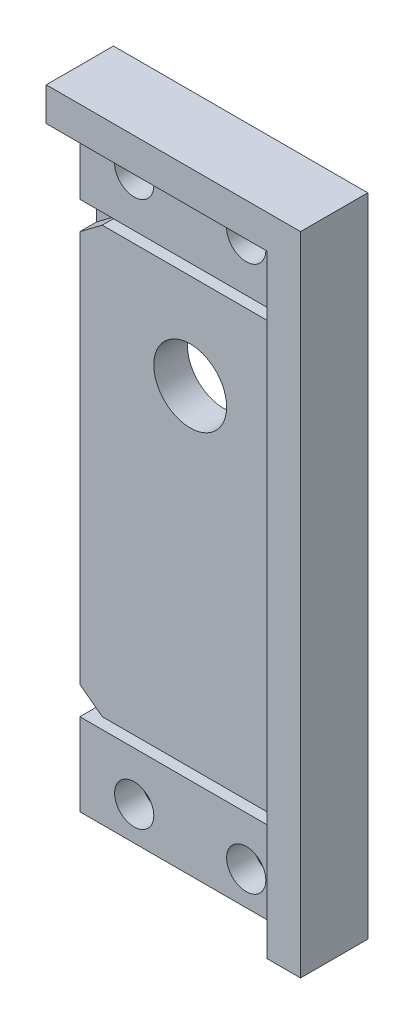
ISO-10303-21;
HEADER;
FILE_DESCRIPTION(('STEP AP214'),'2;1');
FILE_NAME('part.step','',(''),(''),'','','');
FILE_SCHEMA(('AUTOMOTIVE_DESIGN { 1 0 10303 214 1 1 1 1 }'));
ENDSEC;
DATA;
#1=APPLICATION_CONTEXT('core data for automotive mechanical design processes');
#2=APPLICATION_PROTOCOL_DEFINITION('international standard','automotive_design',2000,#1);
#3=PRODUCT_CONTEXT('',#1,'mechanical');
#4=PRODUCT('Part','Part','',(#3));
#5=PRODUCT_RELATED_PRODUCT_CATEGORY('part','',(#4));
#6=PRODUCT_DEFINITION_FORMATION('','',#4);
#7=PRODUCT_DEFINITION_CONTEXT('part definition',#1,'design');
#8=PRODUCT_DEFINITION('design','',#6,#7);
#9=PRODUCT_DEFINITION_SHAPE('','',#8);
#10=(LENGTH_UNIT() NAMED_UNIT(*) SI_UNIT(.MILLI.,.METRE.));
#11=(NAMED_UNIT(*) PLANE_ANGLE_UNIT() SI_UNIT($,.RADIAN.));
#12=(NAMED_UNIT(*) SI_UNIT($,.STERADIAN.) SOLID_ANGLE_UNIT());
#13=UNCERTAINTY_MEASURE_WITH_UNIT(LENGTH_MEASURE(1.E-05),#10,'distance_accuracy_value','');
#14=(GEOMETRIC_REPRESENTATION_CONTEXT(3) GLOBAL_UNCERTAINTY_ASSIGNED_CONTEXT((#13)) GLOBAL_UNIT_ASSIGNED_CONTEXT((#10,
#11,#12)) REPRESENTATION_CONTEXT('',''));
#15=CARTESIAN_POINT('',(0.,0.,0.));
#16=DIRECTION('',(0.,0.,1.));
#17=DIRECTION('',(1.,0.,0.));
#18=AXIS2_PLACEMENT_3D('',#15,#16,#17);
#19=CARTESIAN_POINT('',(0.,0.,3.));
#20=DIRECTION('',(0.,0.,1.));
#21=DIRECTION('',(1.,0.,0.));
#22=AXIS2_PLACEMENT_3D('',#19,#20,#21);
#23=PLANE('',#22);
#24=CARTESIAN_POINT('',(-5.00000000000003,24.35,3.));
#25=DIRECTION('',(0.,0.,1.));
#26=DIRECTION('',(-1.,0.,0.));
#27=AXIS2_PLACEMENT_3D('',#24,#25,#26);
#28=CIRCLE('',#27,1.75);
#29=CARTESIAN_POINT('',(-6.75000000000004,24.35,3.));
#30=VERTEX_POINT('',#29);
#31=EDGE_CURVE('E255',#30,#30,#28,.T.);
#32=ORIENTED_EDGE('',*,*,#31,.F.);
#33=EDGE_LOOP('',(#32));
#34=FACE_BOUND('',#33,.T.);
#35=CARTESIAN_POINT('',(4.99999999999997,24.35,3.));
#36=DIRECTION('',(0.,0.,1.));
#37=DIRECTION('',(-1.,0.,0.));
#38=AXIS2_PLACEMENT_3D('',#35,#36,#37);
#39=CIRCLE('',#38,1.75);
#40=CARTESIAN_POINT('',(3.24999999999997,24.35,3.));
#41=VERTEX_POINT('',#40);
#42=EDGE_CURVE('E308',#41,#41,#39,.T.);
#43=ORIENTED_EDGE('',*,*,#42,.F.);
#44=EDGE_LOOP('',(#43));
#45=FACE_BOUND('',#44,.T.);
#46=DIRECTION('',(0.,-1.,0.));
#47=VECTOR('',#46,1.);
#48=CARTESIAN_POINT('',(-9.85,27.35,3.));
#49=LINE('',#48,#47);
#50=CARTESIAN_POINT('',(-9.85,27.35,3.));
#51=VERTEX_POINT('',#50);
#52=CARTESIAN_POINT('',(-9.85,20.,3.));
#53=VERTEX_POINT('',#52);
#54=EDGE_CURVE('E325',#51,#53,#49,.T.);
#55=ORIENTED_EDGE('',*,*,#54,.T.);
#56=DIRECTION('',(1.,0.,0.));
#57=VECTOR('',#56,1.);
#58=CARTESIAN_POINT('',(0.,20.,3.));
#59=LINE('',#58,#57);
#60=CARTESIAN_POINT('',(9.85,20.,3.));
#61=VERTEX_POINT('',#60);
#62=EDGE_CURVE('E248',#53,#61,#59,.T.);
#63=ORIENTED_EDGE('',*,*,#62,.T.);
#64=DIRECTION('',(0.,1.,0.));
#65=VECTOR('',#64,1.);
#66=CARTESIAN_POINT('',(9.84999999999999,27.35,3.));
#67=LINE('',#66,#65);
#68=CARTESIAN_POINT('',(9.84999999999999,27.35,3.));
#69=VERTEX_POINT('',#68);
#70=EDGE_CURVE('E322',#61,#69,#67,.T.);
#71=ORIENTED_EDGE('',*,*,#70,.T.);
#72=DIRECTION('',(-1.,0.,0.));
#73=VECTOR('',#72,1.);
#74=CARTESIAN_POINT('',(-9.85,27.35,3.));
#75=LINE('',#74,#73);
#76=EDGE_CURVE('E171',#69,#51,#75,.T.);
#77=ORIENTED_EDGE('',*,*,#76,.T.);
#78=EDGE_LOOP('',(#55,#63,#71,#77));
#79=FACE_BOUND('',#78,.T.);
#80=ADVANCED_FACE('F33',(#34,#45,#79),#23,.T.);
#81=CARTESIAN_POINT('',(0.,10.5,3.));
#82=DIRECTION('',(0.,0.,1.));
#83=DIRECTION('',(1.,0.,0.));
#84=AXIS2_PLACEMENT_3D('',#81,#82,#83);
#85=CIRCLE('',#84,3.25);
#86=CARTESIAN_POINT('',(3.25,10.5,3.));
#87=VERTEX_POINT('',#86);
#88=EDGE_CURVE('E209',#87,#87,#85,.T.);
#89=ORIENTED_EDGE('',*,*,#88,.F.);
#90=EDGE_LOOP('',(#89));
#91=FACE_BOUND('',#90,.T.);
#92=DIRECTION('',(0.800000000000001,0.6,0.));
#93=VECTOR('',#92,1.);
#94=CARTESIAN_POINT('',(-11.946,15.928,3.));
#95=LINE('',#94,#93);
#96=CARTESIAN_POINT('',(-9.85,17.5,3.));
#97=VERTEX_POINT('',#96);
#98=CARTESIAN_POINT('',(-7.85,19.,3.));
#99=VERTEX_POINT('',#98);
#100=EDGE_CURVE('E229',#97,#99,#95,.T.);
#101=ORIENTED_EDGE('',*,*,#100,.F.);
#102=CARTESIAN_POINT('',(-9.85,-17.5,3.));
#103=VERTEX_POINT('',#102);
#104=EDGE_CURVE('E329',#97,#103,#49,.T.);
#105=ORIENTED_EDGE('',*,*,#104,.T.);
#106=DIRECTION('',(0.800000000000001,-0.6,0.));
#107=VECTOR('',#106,1.);
#108=CARTESIAN_POINT('',(-11.946,-15.928,3.));
#109=LINE('',#108,#107);
#110=CARTESIAN_POINT('',(-7.85000000000002,-19.,3.));
#111=VERTEX_POINT('',#110);
#112=EDGE_CURVE('E222',#103,#111,#109,.T.);
#113=ORIENTED_EDGE('',*,*,#112,.T.);
#114=DIRECTION('',(1.,0.,0.));
#115=VECTOR('',#114,1.);
#116=CARTESIAN_POINT('',(0.,-19.,3.));
#117=LINE('',#116,#115);
#118=CARTESIAN_POINT('',(7.84999999999999,-19.,3.));
#119=VERTEX_POINT('',#118);
#120=EDGE_CURVE('E269',#111,#119,#117,.T.);
#121=ORIENTED_EDGE('',*,*,#120,.T.);
#122=DIRECTION('',(0.799999999999999,0.600000000000001,0.));
#123=VECTOR('',#122,1.);
#124=CARTESIAN_POINT('',(11.946,-15.928,3.));
#125=LINE('',#124,#123);
#126=CARTESIAN_POINT('',(9.85,-17.5,3.));
#127=VERTEX_POINT('',#126);
#128=EDGE_CURVE('E288',#119,#127,#125,.T.);
#129=ORIENTED_EDGE('',*,*,#128,.T.);
#130=CARTESIAN_POINT('',(9.84999999999999,17.5,3.));
#131=VERTEX_POINT('',#130);
#132=EDGE_CURVE('E321',#127,#131,#67,.T.);
#133=ORIENTED_EDGE('',*,*,#132,.T.);
#134=DIRECTION('',(0.799999999999999,-0.600000000000001,0.));
#135=VECTOR('',#134,1.);
#136=CARTESIAN_POINT('',(11.946,15.928,3.));
#137=LINE('',#136,#135);
#138=CARTESIAN_POINT('',(7.85,19.,3.));
#139=VERTEX_POINT('',#138);
#140=EDGE_CURVE('E244',#139,#131,#137,.T.);
#141=ORIENTED_EDGE('',*,*,#140,.F.);
#142=DIRECTION('',(1.,0.,0.));
#143=VECTOR('',#142,1.);
#144=CARTESIAN_POINT('',(0.,19.,3.));
#145=LINE('',#144,#143);
#146=EDGE_CURVE('E241',#99,#139,#145,.T.);
#147=ORIENTED_EDGE('',*,*,#146,.F.);
#148=EDGE_LOOP('',(#101,#105,#113,#121,#129,#133,#141,#147));
#149=FACE_BOUND('',#148,.T.);
#150=ADVANCED_FACE('F401',(#91,#149),#23,.T.);
#151=CARTESIAN_POINT('',(-9.85,27.35,3.));
#152=DIRECTION('',(1.,0.,0.));
#153=DIRECTION('',(0.,1.,0.));
#154=AXIS2_PLACEMENT_3D('',#151,#152,#153);
#155=PLANE('',#154);
#156=ORIENTED_EDGE('',*,*,#104,.F.);
#157=DIRECTION('',(0.,0.,1.));
#158=VECTOR('',#157,1.);
#159=CARTESIAN_POINT('',(-9.85,17.5,1.5));
#160=LINE('',#159,#158);
#161=CARTESIAN_POINT('',(-9.85,17.5,1.5));
#162=VERTEX_POINT('',#161);
#163=EDGE_CURVE('E256',#162,#97,#160,.T.);
#164=ORIENTED_EDGE('',*,*,#163,.F.);
#165=DIRECTION('',(0.,-1.,0.));
#166=VECTOR('',#165,1.);
#167=CARTESIAN_POINT('',(-9.85,0.,1.5));
#168=LINE('',#167,#166);
#169=CARTESIAN_POINT('',(-9.85,20.,1.5));
#170=VERTEX_POINT('',#169);
#171=EDGE_CURVE('E235',#170,#162,#168,.T.);
#172=ORIENTED_EDGE('',*,*,#171,.F.);
#173=DIRECTION('',(0.,0.,1.));
#174=VECTOR('',#173,1.);
#175=CARTESIAN_POINT('',(-9.85,20.,1.5));
#176=LINE('',#175,#174);
#177=EDGE_CURVE('E258',#170,#53,#176,.T.);
#178=ORIENTED_EDGE('',*,*,#177,.T.);
#179=ORIENTED_EDGE('',*,*,#54,.F.);
#180=DIRECTION('',(0.,0.,-1.));
#181=VECTOR('',#180,1.);
#182=CARTESIAN_POINT('',(-9.85,27.35,6.));
#183=LINE('',#182,#181);
#184=CARTESIAN_POINT('',(-9.85,27.35,6.));
#185=VERTEX_POINT('',#184);
#186=EDGE_CURVE('E175',#185,#51,#183,.T.);
#187=ORIENTED_EDGE('',*,*,#186,.F.);
#188=DIRECTION('',(0.,1.,0.));
#189=VECTOR('',#188,1.);
#190=CARTESIAN_POINT('',(-9.85,30.35,6.));
#191=LINE('',#190,#189);
#192=CARTESIAN_POINT('',(-9.85,30.35,6.));
#193=VERTEX_POINT('',#192);
#194=EDGE_CURVE('E187',#185,#193,#191,.T.);
#195=ORIENTED_EDGE('',*,*,#194,.T.);
#196=DIRECTION('',(0.,0.,-1.));
#197=VECTOR('',#196,1.);
#198=CARTESIAN_POINT('',(-9.85,30.35,6.));
#199=LINE('',#198,#197);
#200=CARTESIAN_POINT('',(-9.85,30.35,0.));
#201=VERTEX_POINT('',#200);
#202=EDGE_CURVE('E215',#193,#201,#199,.T.);
#203=ORIENTED_EDGE('',*,*,#202,.T.);
#204=DIRECTION('',(0.,-1.,0.));
#205=VECTOR('',#204,1.);
#206=CARTESIAN_POINT('',(-9.85,27.35,0.));
#207=LINE('',#206,#205);
#208=CARTESIAN_POINT('',(-9.85,-27.35,0.));
#209=VERTEX_POINT('',#208);
#210=EDGE_CURVE('E317',#201,#209,#207,.T.);
#211=ORIENTED_EDGE('',*,*,#210,.T.);
#212=DIRECTION('',(0.,0.,-1.));
#213=VECTOR('',#212,1.);
#214=CARTESIAN_POINT('',(-9.85,-27.35,3.));
#215=LINE('',#214,#213);
#216=CARTESIAN_POINT('',(-9.85,-27.35,3.));
#217=VERTEX_POINT('',#216);
#218=EDGE_CURVE('E332',#217,#209,#215,.T.);
#219=ORIENTED_EDGE('',*,*,#218,.F.);
#220=CARTESIAN_POINT('',(-9.85,-20.,3.));
#221=VERTEX_POINT('',#220);
#222=EDGE_CURVE('E324',#221,#217,#49,.T.);
#223=ORIENTED_EDGE('',*,*,#222,.F.);
#224=DIRECTION('',(0.,0.,1.));
#225=VECTOR('',#224,1.);
#226=CARTESIAN_POINT('',(-9.85,-20.,1.5));
#227=LINE('',#226,#225);
#228=CARTESIAN_POINT('',(-9.85,-20.,1.5));
#229=VERTEX_POINT('',#228);
#230=EDGE_CURVE('E302',#229,#221,#227,.T.);
#231=ORIENTED_EDGE('',*,*,#230,.F.);
#232=DIRECTION('',(0.,-1.,0.));
#233=VECTOR('',#232,1.);
#234=CARTESIAN_POINT('',(-9.85,0.,1.5));
#235=LINE('',#234,#233);
#236=CARTESIAN_POINT('',(-9.85,-17.5,1.5));
#237=VERTEX_POINT('',#236);
#238=EDGE_CURVE('E268',#237,#229,#235,.T.);
#239=ORIENTED_EDGE('',*,*,#238,.F.);
#240=DIRECTION('',(0.,0.,1.));
#241=VECTOR('',#240,1.);
#242=CARTESIAN_POINT('',(-9.85,-17.5,1.5));
#243=LINE('',#242,#241);
#244=EDGE_CURVE('E282',#237,#103,#243,.T.);
#245=ORIENTED_EDGE('',*,*,#244,.T.);
#246=EDGE_LOOP('',(#156,#164,#172,#178,#179,#187,#195,#203,#211,#219,#223,#231,#239,#245));
#247=FACE_BOUND('',#246,.T.);
#248=ADVANCED_FACE('F388',(#247),#155,.F.);
#249=DIRECTION('',(1.,0.,0.));
#250=VECTOR('',#249,1.);
#251=CARTESIAN_POINT('',(0.,-20.,3.));
#252=LINE('',#251,#250);
#253=CARTESIAN_POINT('',(9.85,-20.,3.));
#254=VERTEX_POINT('',#253);
#255=EDGE_CURVE('E285',#221,#254,#252,.T.);
#256=ORIENTED_EDGE('',*,*,#255,.F.);
#257=ORIENTED_EDGE('',*,*,#222,.T.);
#258=DIRECTION('',(1.,0.,0.));
#259=VECTOR('',#258,1.);
#260=CARTESIAN_POINT('',(-9.85,-27.35,3.));
#261=LINE('',#260,#259);
#262=CARTESIAN_POINT('',(9.85,-27.35,3.));
#263=VERTEX_POINT('',#262);
#264=EDGE_CURVE('E328',#217,#263,#261,.T.);
#265=ORIENTED_EDGE('',*,*,#264,.T.);
#266=EDGE_CURVE('E318',#263,#254,#67,.T.);
#267=ORIENTED_EDGE('',*,*,#266,.T.);
#268=EDGE_LOOP('',(#256,#257,#265,#267));
#269=FACE_BOUND('',#268,.T.);
#270=CARTESIAN_POINT('',(-5.,-24.35,3.));
#271=DIRECTION('',(0.,0.,1.));
#272=DIRECTION('',(1.,0.,0.));
#273=AXIS2_PLACEMENT_3D('',#270,#271,#272);
#274=CIRCLE('',#273,1.75);
#275=CARTESIAN_POINT('',(-3.25,-24.35,3.));
#276=VERTEX_POINT('',#275);
#277=EDGE_CURVE('E314',#276,#276,#274,.T.);
#278=ORIENTED_EDGE('',*,*,#277,.F.);
#279=EDGE_LOOP('',(#278));
#280=FACE_BOUND('',#279,.T.);
#281=CARTESIAN_POINT('',(5.,-24.35,3.));
#282=DIRECTION('',(0.,0.,1.));
#283=DIRECTION('',(1.,0.,0.));
#284=AXIS2_PLACEMENT_3D('',#281,#282,#283);
#285=CIRCLE('',#284,1.75);
#286=CARTESIAN_POINT('',(6.75,-24.35,3.));
#287=VERTEX_POINT('',#286);
#288=EDGE_CURVE('E311',#287,#287,#285,.T.);
#289=ORIENTED_EDGE('',*,*,#288,.F.);
#290=EDGE_LOOP('',(#289));
#291=FACE_BOUND('',#290,.T.);
#292=ADVANCED_FACE('F371',(#269,#280,#291),#23,.T.);
#293=CARTESIAN_POINT('',(0.,0.,0.));
#294=DIRECTION('',(0.,0.,1.));
#295=DIRECTION('',(1.,0.,0.));
#296=AXIS2_PLACEMENT_3D('',#293,#294,#295);
#297=PLANE('',#296);
#298=CARTESIAN_POINT('',(0.,10.5,0.));
#299=DIRECTION('',(0.,0.,1.));
#300=DIRECTION('',(1.,0.,0.));
#301=AXIS2_PLACEMENT_3D('',#298,#299,#300);
#302=CIRCLE('',#301,3.25);
#303=CARTESIAN_POINT('',(3.25,10.5,0.));
#304=VERTEX_POINT('',#303);
#305=EDGE_CURVE('E219',#304,#304,#302,.T.);
#306=ORIENTED_EDGE('',*,*,#305,.T.);
#307=EDGE_LOOP('',(#306));
#308=FACE_BOUND('',#307,.T.);
#309=CARTESIAN_POINT('',(-5.,-24.35,0.));
#310=DIRECTION('',(0.,0.,1.));
#311=DIRECTION('',(1.,0.,0.));
#312=AXIS2_PLACEMENT_3D('',#309,#310,#311);
#313=CIRCLE('',#312,2.35);
#314=CARTESIAN_POINT('',(-2.65,-24.35,0.));
#315=VERTEX_POINT('',#314);
#316=EDGE_CURVE('E347',#315,#315,#313,.T.);
#317=ORIENTED_EDGE('',*,*,#316,.T.);
#318=EDGE_LOOP('',(#317));
#319=FACE_BOUND('',#318,.T.);
#320=CARTESIAN_POINT('',(5.,-24.35,0.));
#321=DIRECTION('',(0.,0.,1.));
#322=DIRECTION('',(1.,0.,0.));
#323=AXIS2_PLACEMENT_3D('',#320,#321,#322);
#324=CIRCLE('',#323,2.35000000000001);
#325=CARTESIAN_POINT('',(7.35000000000002,-24.35,0.));
#326=VERTEX_POINT('',#325);
#327=EDGE_CURVE('E344',#326,#326,#324,.T.);
#328=ORIENTED_EDGE('',*,*,#327,.T.);
#329=EDGE_LOOP('',(#328));
#330=FACE_BOUND('',#329,.T.);
#331=CARTESIAN_POINT('',(-5.00000000000003,24.35,0.));
#332=DIRECTION('',(0.,0.,1.));
#333=DIRECTION('',(1.,0.,0.));
#334=AXIS2_PLACEMENT_3D('',#331,#332,#333);
#335=CIRCLE('',#334,2.35000000000002);
#336=CARTESIAN_POINT('',(-2.65000000000001,24.35,0.));
#337=VERTEX_POINT('',#336);
#338=EDGE_CURVE('E341',#337,#337,#335,.T.);
#339=ORIENTED_EDGE('',*,*,#338,.T.);
#340=EDGE_LOOP('',(#339));
#341=FACE_BOUND('',#340,.T.);
#342=CARTESIAN_POINT('',(4.99999999999997,24.35,0.));
#343=DIRECTION('',(0.,0.,1.));
#344=DIRECTION('',(1.,0.,0.));
#345=AXIS2_PLACEMENT_3D('',#342,#343,#344);
#346=CIRCLE('',#345,2.35);
#347=CARTESIAN_POINT('',(7.34999999999997,24.35,0.));
#348=VERTEX_POINT('',#347);
#349=EDGE_CURVE('E338',#348,#348,#346,.T.);
#350=ORIENTED_EDGE('',*,*,#349,.T.);
#351=EDGE_LOOP('',(#350));
#352=FACE_BOUND('',#351,.T.);
#353=DIRECTION('',(0.,-1.,0.));
#354=VECTOR('',#353,1.);
#355=CARTESIAN_POINT('',(12.85,-27.35,0.));
#356=LINE('',#355,#354);
#357=CARTESIAN_POINT('',(12.85,30.35,0.));
#358=VERTEX_POINT('',#357);
#359=CARTESIAN_POINT('',(12.85,-27.35,0.));
#360=VERTEX_POINT('',#359);
#361=EDGE_CURVE('E192',#358,#360,#356,.T.);
#362=ORIENTED_EDGE('',*,*,#361,.T.);
#363=DIRECTION('',(1.,0.,0.));
#364=VECTOR('',#363,1.);
#365=CARTESIAN_POINT('',(-9.85,-27.35,0.));
#366=LINE('',#365,#364);
#367=EDGE_CURVE('E334',#209,#360,#366,.T.);
#368=ORIENTED_EDGE('',*,*,#367,.F.);
#369=ORIENTED_EDGE('',*,*,#210,.F.);
#370=DIRECTION('',(1.,0.,0.));
#371=VECTOR('',#370,1.);
#372=CARTESIAN_POINT('',(12.85,30.35,0.));
#373=LINE('',#372,#371);
#374=EDGE_CURVE('E195',#201,#358,#373,.T.);
#375=ORIENTED_EDGE('',*,*,#374,.T.);
#376=EDGE_LOOP('',(#362,#368,#369,#375));
#377=FACE_BOUND('',#376,.T.);
#378=ADVANCED_FACE('F367',(#308,#319,#330,#341,#352,#377),#297,.F.);
#379=CARTESIAN_POINT('',(-9.85,-27.35,3.));
#380=DIRECTION('',(0.,1.,0.));
#381=DIRECTION('',(0.,0.,1.));
#382=AXIS2_PLACEMENT_3D('',#379,#380,#381);
#383=PLANE('',#382);
#384=ORIENTED_EDGE('',*,*,#367,.T.);
#385=DIRECTION('',(0.,0.,-1.));
#386=VECTOR('',#385,1.);
#387=CARTESIAN_POINT('',(12.85,-27.35,6.));
#388=LINE('',#387,#386);
#389=CARTESIAN_POINT('',(12.85,-27.35,6.));
#390=VERTEX_POINT('',#389);
#391=EDGE_CURVE('E210',#390,#360,#388,.T.);
#392=ORIENTED_EDGE('',*,*,#391,.F.);
#393=DIRECTION('',(-1.,0.,0.));
#394=VECTOR('',#393,1.);
#395=CARTESIAN_POINT('',(9.85,-27.35,6.));
#396=LINE('',#395,#394);
#397=CARTESIAN_POINT('',(9.85,-27.35,6.));
#398=VERTEX_POINT('',#397);
#399=EDGE_CURVE('E176',#390,#398,#396,.T.);
#400=ORIENTED_EDGE('',*,*,#399,.T.);
#401=DIRECTION('',(0.,0.,-1.));
#402=VECTOR('',#401,1.);
#403=CARTESIAN_POINT('',(9.85,-27.35,6.));
#404=LINE('',#403,#402);
#405=EDGE_CURVE('E191',#398,#263,#404,.T.);
#406=ORIENTED_EDGE('',*,*,#405,.T.);
#407=ORIENTED_EDGE('',*,*,#264,.F.);
#408=ORIENTED_EDGE('',*,*,#218,.T.);
#409=EDGE_LOOP('',(#384,#392,#400,#406,#407,#408));
#410=FACE_BOUND('',#409,.T.);
#411=ADVANCED_FACE('F370',(#410),#383,.F.);
#412=CARTESIAN_POINT('',(-5.,-24.35,3.));
#413=DIRECTION('',(0.,0.,-1.));
#414=DIRECTION('',(-1.,0.,0.));
#415=AXIS2_PLACEMENT_3D('',#412,#413,#414);
#416=CYLINDRICAL_SURFACE('',#415,1.75);
#417=CARTESIAN_POINT('',(-5.,-24.35,0.6));
#418=DIRECTION('',(0.,0.,1.));
#419=DIRECTION('',(1.,0.,0.));
#420=AXIS2_PLACEMENT_3D('',#417,#418,#419);
#421=CIRCLE('',#420,1.75);
#422=CARTESIAN_POINT('',(-3.25,-24.35,0.6));
#423=VERTEX_POINT('',#422);
#424=EDGE_CURVE('E350',#423,#423,#421,.F.);
#425=ORIENTED_EDGE('',*,*,#424,.T.);
#426=EDGE_LOOP('',(#425));
#427=FACE_BOUND('',#426,.T.);
#428=ORIENTED_EDGE('',*,*,#277,.T.);
#429=EDGE_LOOP('',(#428));
#430=FACE_BOUND('',#429,.T.);
#431=ADVANCED_FACE('F426',(#427,#430),#416,.F.);
#432=CARTESIAN_POINT('',(5.,-24.35,3.));
#433=DIRECTION('',(0.,0.,-1.));
#434=DIRECTION('',(-1.,0.,0.));
#435=AXIS2_PLACEMENT_3D('',#432,#433,#434);
#436=CYLINDRICAL_SURFACE('',#435,1.75);
#437=CARTESIAN_POINT('',(5.,-24.35,0.600000000000004));
#438=DIRECTION('',(0.,0.,1.));
#439=DIRECTION('',(1.,0.,0.));
#440=AXIS2_PLACEMENT_3D('',#437,#438,#439);
#441=CIRCLE('',#440,1.75);
#442=CARTESIAN_POINT('',(6.75,-24.35,0.600000000000004));
#443=VERTEX_POINT('',#442);
#444=EDGE_CURVE('E353',#443,#443,#441,.F.);
#445=ORIENTED_EDGE('',*,*,#444,.T.);
#446=EDGE_LOOP('',(#445));
#447=FACE_BOUND('',#446,.T.);
#448=ORIENTED_EDGE('',*,*,#288,.T.);
#449=EDGE_LOOP('',(#448));
#450=FACE_BOUND('',#449,.T.);
#451=ADVANCED_FACE('F423',(#447,#450),#436,.F.);
#452=CARTESIAN_POINT('',(4.99999999999997,24.35,3.));
#453=DIRECTION('',(0.,0.,-1.));
#454=DIRECTION('',(-1.,0.,0.));
#455=AXIS2_PLACEMENT_3D('',#452,#453,#454);
#456=CYLINDRICAL_SURFACE('',#455,1.75);
#457=CARTESIAN_POINT('',(4.99999999999997,24.35,0.6));
#458=DIRECTION('',(0.,0.,1.));
#459=DIRECTION('',(1.,0.,0.));
#460=AXIS2_PLACEMENT_3D('',#457,#458,#459);
#461=CIRCLE('',#460,1.75);
#462=CARTESIAN_POINT('',(6.74999999999997,24.35,0.6));
#463=VERTEX_POINT('',#462);
#464=EDGE_CURVE('E11',#463,#463,#461,.F.);
#465=ORIENTED_EDGE('',*,*,#464,.T.);
#466=EDGE_LOOP('',(#465));
#467=FACE_BOUND('',#466,.T.);
#468=ORIENTED_EDGE('',*,*,#42,.T.);
#469=EDGE_LOOP('',(#468));
#470=FACE_BOUND('',#469,.T.);
#471=ADVANCED_FACE('F425',(#467,#470),#456,.F.);
#472=CARTESIAN_POINT('',(-5.00000000000003,24.35,3.));
#473=DIRECTION('',(0.,0.,-1.));
#474=DIRECTION('',(-1.,0.,0.));
#475=AXIS2_PLACEMENT_3D('',#472,#473,#474);
#476=CYLINDRICAL_SURFACE('',#475,1.75);
#477=CARTESIAN_POINT('',(-5.00000000000003,24.35,0.600000000000016));
#478=DIRECTION('',(0.,0.,1.));
#479=DIRECTION('',(1.,0.,0.));
#480=AXIS2_PLACEMENT_3D('',#477,#478,#479);
#481=CIRCLE('',#480,1.75);
#482=CARTESIAN_POINT('',(-3.25000000000003,24.35,0.600000000000016));
#483=VERTEX_POINT('',#482);
#484=EDGE_CURVE('E41',#483,#483,#481,.F.);
#485=ORIENTED_EDGE('',*,*,#484,.T.);
#486=EDGE_LOOP('',(#485));
#487=FACE_BOUND('',#486,.T.);
#488=ORIENTED_EDGE('',*,*,#31,.T.);
#489=EDGE_LOOP('',(#488));
#490=FACE_BOUND('',#489,.T.);
#491=ADVANCED_FACE('F358',(#487,#490),#476,.F.);
#492=CARTESIAN_POINT('',(-5.,-24.35,0.));
#493=DIRECTION('',(0.,0.,-1.));
#494=DIRECTION('',(-1.,0.,0.));
#495=AXIS2_PLACEMENT_3D('',#492,#493,#494);
#496=CONICAL_SURFACE('',#495,2.35,0.785398163397446);
#497=ORIENTED_EDGE('',*,*,#424,.F.);
#498=EDGE_LOOP('',(#497));
#499=FACE_BOUND('',#498,.T.);
#500=ORIENTED_EDGE('',*,*,#316,.F.);
#501=EDGE_LOOP('',(#500));
#502=FACE_BOUND('',#501,.T.);
#503=ADVANCED_FACE('F439',(#499,#502),#496,.F.);
#504=CARTESIAN_POINT('',(5.,-24.35,0.));
#505=DIRECTION('',(0.,0.,-1.));
#506=DIRECTION('',(-1.,0.,0.));
#507=AXIS2_PLACEMENT_3D('',#504,#505,#506);
#508=CONICAL_SURFACE('',#507,2.35000000000001,0.785398163397454);
#509=ORIENTED_EDGE('',*,*,#444,.F.);
#510=EDGE_LOOP('',(#509));
#511=FACE_BOUND('',#510,.T.);
#512=ORIENTED_EDGE('',*,*,#327,.F.);
#513=EDGE_LOOP('',(#512));
#514=FACE_BOUND('',#513,.T.);
#515=ADVANCED_FACE('F364',(#511,#514),#508,.F.);
#516=CARTESIAN_POINT('',(-5.00000000000003,24.35,0.));
#517=DIRECTION('',(0.,0.,-1.));
#518=DIRECTION('',(-1.,0.,0.));
#519=AXIS2_PLACEMENT_3D('',#516,#517,#518);
#520=CONICAL_SURFACE('',#519,2.35000000000002,0.785398163397448);
#521=ORIENTED_EDGE('',*,*,#484,.F.);
#522=EDGE_LOOP('',(#521));
#523=FACE_BOUND('',#522,.T.);
#524=ORIENTED_EDGE('',*,*,#338,.F.);
#525=EDGE_LOOP('',(#524));
#526=FACE_BOUND('',#525,.T.);
#527=ADVANCED_FACE('F361',(#523,#526),#520,.F.);
#528=CARTESIAN_POINT('',(4.99999999999997,24.35,0.));
#529=DIRECTION('',(0.,0.,-1.));
#530=DIRECTION('',(-1.,0.,0.));
#531=AXIS2_PLACEMENT_3D('',#528,#529,#530);
#532=CONICAL_SURFACE('',#531,2.35,0.785398163397445);
#533=ORIENTED_EDGE('',*,*,#464,.F.);
#534=EDGE_LOOP('',(#533));
#535=FACE_BOUND('',#534,.T.);
#536=ORIENTED_EDGE('',*,*,#349,.F.);
#537=EDGE_LOOP('',(#536));
#538=FACE_BOUND('',#537,.T.);
#539=ADVANCED_FACE('F35',(#535,#538),#532,.F.);
#540=CARTESIAN_POINT('',(-11.946,-15.928,1.5));
#541=DIRECTION('',(-0.599999999999999,-0.8,0.));
#542=DIRECTION('',(0.8,-0.599999999999999,0.));
#543=AXIS2_PLACEMENT_3D('',#540,#541,#542);
#544=PLANE('',#543);
#545=ORIENTED_EDGE('',*,*,#112,.F.);
#546=ORIENTED_EDGE('',*,*,#244,.F.);
#547=DIRECTION('',(0.800000000000001,-0.6,0.));
#548=VECTOR('',#547,1.);
#549=CARTESIAN_POINT('',(-11.946,-15.928,1.5));
#550=LINE('',#549,#548);
#551=CARTESIAN_POINT('',(-7.85000000000002,-19.,1.5));
#552=VERTEX_POINT('',#551);
#553=EDGE_CURVE('E56',#237,#552,#550,.T.);
#554=ORIENTED_EDGE('',*,*,#553,.T.);
#555=DIRECTION('',(0.,0.,1.));
#556=VECTOR('',#555,1.);
#557=CARTESIAN_POINT('',(-7.85000000000002,-19.,1.5));
#558=LINE('',#557,#556);
#559=EDGE_CURVE('E245',#552,#111,#558,.T.);
#560=ORIENTED_EDGE('',*,*,#559,.T.);
#561=EDGE_LOOP('',(#545,#546,#554,#560));
#562=FACE_BOUND('',#561,.T.);
#563=ADVANCED_FACE('F440',(#562),#544,.T.);
#564=CARTESIAN_POINT('',(0.,-19.,1.5));
#565=DIRECTION('',(0.,-1.,0.));
#566=DIRECTION('',(1.,0.,0.));
#567=AXIS2_PLACEMENT_3D('',#564,#565,#566);
#568=PLANE('',#567);
#569=ORIENTED_EDGE('',*,*,#120,.F.);
#570=ORIENTED_EDGE('',*,*,#559,.F.);
#571=DIRECTION('',(1.,0.,0.));
#572=VECTOR('',#571,1.);
#573=CARTESIAN_POINT('',(0.,-19.,1.5));
#574=LINE('',#573,#572);
#575=CARTESIAN_POINT('',(7.84999999999999,-19.,1.5));
#576=VERTEX_POINT('',#575);
#577=EDGE_CURVE('E280',#552,#576,#574,.T.);
#578=ORIENTED_EDGE('',*,*,#577,.T.);
#579=DIRECTION('',(0.,0.,1.));
#580=VECTOR('',#579,1.);
#581=CARTESIAN_POINT('',(7.84999999999999,-19.,1.5));
#582=LINE('',#581,#580);
#583=EDGE_CURVE('E295',#576,#119,#582,.T.);
#584=ORIENTED_EDGE('',*,*,#583,.T.);
#585=EDGE_LOOP('',(#569,#570,#578,#584));
#586=FACE_BOUND('',#585,.T.);
#587=ADVANCED_FACE('F443',(#586),#568,.T.);
#588=CARTESIAN_POINT('',(11.946,-15.928,1.5));
#589=DIRECTION('',(0.600000000000001,-0.799999999999999,0.));
#590=DIRECTION('',(0.799999999999999,0.600000000000001,0.));
#591=AXIS2_PLACEMENT_3D('',#588,#589,#590);
#592=PLANE('',#591);
#593=ORIENTED_EDGE('',*,*,#128,.F.);
#594=ORIENTED_EDGE('',*,*,#583,.F.);
#595=DIRECTION('',(0.799999999999999,0.600000000000001,0.));
#596=VECTOR('',#595,1.);
#597=CARTESIAN_POINT('',(11.946,-15.928,1.5));
#598=LINE('',#597,#596);
#599=CARTESIAN_POINT('',(9.85,-17.5,1.5));
#600=VERTEX_POINT('',#599);
#601=EDGE_CURVE('E277',#576,#600,#598,.T.);
#602=ORIENTED_EDGE('',*,*,#601,.T.);
#603=DIRECTION('',(0.,0.,1.));
#604=VECTOR('',#603,1.);
#605=CARTESIAN_POINT('',(9.85,-17.5,1.5));
#606=LINE('',#605,#604);
#607=EDGE_CURVE('E297',#600,#127,#606,.T.);
#608=ORIENTED_EDGE('',*,*,#607,.T.);
#609=EDGE_LOOP('',(#593,#594,#602,#608));
#610=FACE_BOUND('',#609,.T.);
#611=ADVANCED_FACE('F449',(#610),#592,.T.);
#612=CARTESIAN_POINT('',(0.,-20.,1.5));
#613=DIRECTION('',(0.,-1.,0.));
#614=DIRECTION('',(0.,0.,-1.));
#615=AXIS2_PLACEMENT_3D('',#612,#613,#614);
#616=PLANE('',#615);
#617=ORIENTED_EDGE('',*,*,#255,.T.);
#618=DIRECTION('',(0.,0.,1.));
#619=VECTOR('',#618,1.);
#620=CARTESIAN_POINT('',(9.85,-20.,1.5));
#621=LINE('',#620,#619);
#622=CARTESIAN_POINT('',(9.85,-20.,1.5));
#623=VERTEX_POINT('',#622);
#624=EDGE_CURVE('E300',#623,#254,#621,.T.);
#625=ORIENTED_EDGE('',*,*,#624,.F.);
#626=DIRECTION('',(1.,0.,0.));
#627=VECTOR('',#626,1.);
#628=CARTESIAN_POINT('',(0.,-20.,1.5));
#629=LINE('',#628,#627);
#630=EDGE_CURVE('E271',#229,#623,#629,.T.);
#631=ORIENTED_EDGE('',*,*,#630,.F.);
#632=ORIENTED_EDGE('',*,*,#230,.T.);
#633=EDGE_LOOP('',(#617,#625,#631,#632));
#634=FACE_BOUND('',#633,.T.);
#635=ADVANCED_FACE('F445',(#634),#616,.F.);
#636=CARTESIAN_POINT('',(0.,0.,1.5));
#637=DIRECTION('',(0.,0.,1.));
#638=DIRECTION('',(1.,0.,0.));
#639=AXIS2_PLACEMENT_3D('',#636,#637,#638);
#640=PLANE('',#639);
#641=ORIENTED_EDGE('',*,*,#553,.F.);
#642=ORIENTED_EDGE('',*,*,#238,.T.);
#643=ORIENTED_EDGE('',*,*,#630,.T.);
#644=DIRECTION('',(0.,1.,0.));
#645=VECTOR('',#644,1.);
#646=CARTESIAN_POINT('',(9.85,0.,1.5));
#647=LINE('',#646,#645);
#648=EDGE_CURVE('E274',#623,#600,#647,.T.);
#649=ORIENTED_EDGE('',*,*,#648,.T.);
#650=ORIENTED_EDGE('',*,*,#601,.F.);
#651=ORIENTED_EDGE('',*,*,#577,.F.);
#652=EDGE_LOOP('',(#641,#642,#643,#649,#650,#651));
#653=FACE_BOUND('',#652,.T.);
#654=ADVANCED_FACE('F448',(#653),#640,.T.);
#655=CARTESIAN_POINT('',(0.,19.,1.5));
#656=DIRECTION('',(0.,-1.,0.));
#657=DIRECTION('',(0.,0.,-1.));
#658=AXIS2_PLACEMENT_3D('',#655,#656,#657);
#659=PLANE('',#658);
#660=ORIENTED_EDGE('',*,*,#146,.T.);
#661=DIRECTION('',(0.,0.,1.));
#662=VECTOR('',#661,1.);
#663=CARTESIAN_POINT('',(7.85,19.,1.5));
#664=LINE('',#663,#662);
#665=CARTESIAN_POINT('',(7.85,19.,1.5));
#666=VERTEX_POINT('',#665);
#667=EDGE_CURVE('E240',#666,#139,#664,.T.);
#668=ORIENTED_EDGE('',*,*,#667,.F.);
#669=DIRECTION('',(1.,0.,0.));
#670=VECTOR('',#669,1.);
#671=CARTESIAN_POINT('',(0.,19.,1.5));
#672=LINE('',#671,#670);
#673=CARTESIAN_POINT('',(-7.85,19.,1.5));
#674=VERTEX_POINT('',#673);
#675=EDGE_CURVE('E225',#674,#666,#672,.T.);
#676=ORIENTED_EDGE('',*,*,#675,.F.);
#677=DIRECTION('',(0.,0.,1.));
#678=VECTOR('',#677,1.);
#679=CARTESIAN_POINT('',(-7.85,19.,1.5));
#680=LINE('',#679,#678);
#681=EDGE_CURVE('E253',#674,#99,#680,.T.);
#682=ORIENTED_EDGE('',*,*,#681,.T.);
#683=EDGE_LOOP('',(#660,#668,#676,#682));
#684=FACE_BOUND('',#683,.T.);
#685=ADVANCED_FACE('F459',(#684),#659,.F.);
#686=CARTESIAN_POINT('',(-11.946,15.928,1.5));
#687=DIRECTION('',(0.599999999999999,-0.8,0.));
#688=DIRECTION('',(0.8,0.599999999999999,0.));
#689=AXIS2_PLACEMENT_3D('',#686,#687,#688);
#690=PLANE('',#689);
#691=ORIENTED_EDGE('',*,*,#100,.T.);
#692=ORIENTED_EDGE('',*,*,#681,.F.);
#693=DIRECTION('',(0.800000000000001,0.6,0.));
#694=VECTOR('',#693,1.);
#695=CARTESIAN_POINT('',(-11.946,15.928,1.5));
#696=LINE('',#695,#694);
#697=EDGE_CURVE('E237',#162,#674,#696,.T.);
#698=ORIENTED_EDGE('',*,*,#697,.F.);
#699=ORIENTED_EDGE('',*,*,#163,.T.);
#700=EDGE_LOOP('',(#691,#692,#698,#699));
#701=FACE_BOUND('',#700,.T.);
#702=ADVANCED_FACE('F462',(#701),#690,.F.);
#703=CARTESIAN_POINT('',(0.,20.,1.5));
#704=DIRECTION('',(0.,-1.,0.));
#705=DIRECTION('',(0.,0.,-1.));
#706=AXIS2_PLACEMENT_3D('',#703,#704,#705);
#707=PLANE('',#706);
#708=ORIENTED_EDGE('',*,*,#62,.F.);
#709=ORIENTED_EDGE('',*,*,#177,.F.);
#710=DIRECTION('',(1.,0.,0.));
#711=VECTOR('',#710,1.);
#712=CARTESIAN_POINT('',(0.,20.,1.5));
#713=LINE('',#712,#711);
#714=CARTESIAN_POINT('',(9.85,20.,1.5));
#715=VERTEX_POINT('',#714);
#716=EDGE_CURVE('E48',#170,#715,#713,.T.);
#717=ORIENTED_EDGE('',*,*,#716,.T.);
#718=DIRECTION('',(0.,0.,1.));
#719=VECTOR('',#718,1.);
#720=CARTESIAN_POINT('',(9.85,20.,1.5));
#721=LINE('',#720,#719);
#722=EDGE_CURVE('E261',#715,#61,#721,.T.);
#723=ORIENTED_EDGE('',*,*,#722,.T.);
#724=EDGE_LOOP('',(#708,#709,#717,#723));
#725=FACE_BOUND('',#724,.T.);
#726=ADVANCED_FACE('F468',(#725),#707,.T.);
#727=CARTESIAN_POINT('',(11.946,15.928,1.5));
#728=DIRECTION('',(-0.600000000000001,-0.799999999999999,0.));
#729=DIRECTION('',(0.799999999999999,-0.600000000000001,0.));
#730=AXIS2_PLACEMENT_3D('',#727,#728,#729);
#731=PLANE('',#730);
#732=ORIENTED_EDGE('',*,*,#140,.T.);
#733=DIRECTION('',(0.,0.,1.));
#734=VECTOR('',#733,1.);
#735=CARTESIAN_POINT('',(9.84999999999999,17.5,1.5));
#736=LINE('',#735,#734);
#737=CARTESIAN_POINT('',(9.85,17.5,1.5));
#738=VERTEX_POINT('',#737);
#739=EDGE_CURVE('E264',#738,#131,#736,.T.);
#740=ORIENTED_EDGE('',*,*,#739,.F.);
#741=DIRECTION('',(0.799999999999999,-0.600000000000001,0.));
#742=VECTOR('',#741,1.);
#743=CARTESIAN_POINT('',(11.946,15.928,1.5));
#744=LINE('',#743,#742);
#745=EDGE_CURVE('E228',#666,#738,#744,.T.);
#746=ORIENTED_EDGE('',*,*,#745,.F.);
#747=ORIENTED_EDGE('',*,*,#667,.T.);
#748=EDGE_LOOP('',(#732,#740,#746,#747));
#749=FACE_BOUND('',#748,.T.);
#750=ADVANCED_FACE('F464',(#749),#731,.F.);
#751=CARTESIAN_POINT('',(0.,0.,1.5));
#752=DIRECTION('',(0.,0.,1.));
#753=DIRECTION('',(1.,0.,0.));
#754=AXIS2_PLACEMENT_3D('',#751,#752,#753);
#755=PLANE('',#754);
#756=ORIENTED_EDGE('',*,*,#675,.T.);
#757=ORIENTED_EDGE('',*,*,#745,.T.);
#758=DIRECTION('',(0.,1.,0.));
#759=VECTOR('',#758,1.);
#760=CARTESIAN_POINT('',(9.85,0.,1.5));
#761=LINE('',#760,#759);
#762=EDGE_CURVE('E232',#738,#715,#761,.T.);
#763=ORIENTED_EDGE('',*,*,#762,.T.);
#764=ORIENTED_EDGE('',*,*,#716,.F.);
#765=ORIENTED_EDGE('',*,*,#171,.T.);
#766=ORIENTED_EDGE('',*,*,#697,.T.);
#767=EDGE_LOOP('',(#756,#757,#763,#764,#765,#766));
#768=FACE_BOUND('',#767,.T.);
#769=ADVANCED_FACE('F467',(#768),#755,.T.);
#770=CARTESIAN_POINT('',(0.,10.5,0.));
#771=DIRECTION('',(0.,0.,1.));
#772=DIRECTION('',(1.,0.,0.));
#773=AXIS2_PLACEMENT_3D('',#770,#771,#772);
#774=CYLINDRICAL_SURFACE('',#773,3.25);
#775=ORIENTED_EDGE('',*,*,#305,.F.);
#776=EDGE_LOOP('',(#775));
#777=FACE_BOUND('',#776,.T.);
#778=ORIENTED_EDGE('',*,*,#88,.T.);
#779=EDGE_LOOP('',(#778));
#780=FACE_BOUND('',#779,.T.);
#781=ADVANCED_FACE('F478',(#777,#780),#774,.F.);
#782=CARTESIAN_POINT('',(9.84999999999999,27.35,6.));
#783=DIRECTION('',(-1.,0.,0.));
#784=DIRECTION('',(0.,-1.,0.));
#785=AXIS2_PLACEMENT_3D('',#782,#783,#784);
#786=PLANE('',#785);
#787=ORIENTED_EDGE('',*,*,#624,.T.);
#788=ORIENTED_EDGE('',*,*,#266,.F.);
#789=ORIENTED_EDGE('',*,*,#405,.F.);
#790=DIRECTION('',(0.,1.,0.));
#791=VECTOR('',#790,1.);
#792=CARTESIAN_POINT('',(9.84999999999999,27.35,6.));
#793=LINE('',#792,#791);
#794=CARTESIAN_POINT('',(9.84999999999999,27.35,6.));
#795=VERTEX_POINT('',#794);
#796=EDGE_CURVE('E183',#398,#795,#793,.T.);
#797=ORIENTED_EDGE('',*,*,#796,.T.);
#798=DIRECTION('',(0.,0.,-1.));
#799=VECTOR('',#798,1.);
#800=CARTESIAN_POINT('',(9.84999999999999,27.35,6.));
#801=LINE('',#800,#799);
#802=EDGE_CURVE('E166',#795,#69,#801,.T.);
#803=ORIENTED_EDGE('',*,*,#802,.T.);
#804=ORIENTED_EDGE('',*,*,#70,.F.);
#805=ORIENTED_EDGE('',*,*,#722,.F.);
#806=ORIENTED_EDGE('',*,*,#762,.F.);
#807=ORIENTED_EDGE('',*,*,#739,.T.);
#808=ORIENTED_EDGE('',*,*,#132,.F.);
#809=ORIENTED_EDGE('',*,*,#607,.F.);
#810=ORIENTED_EDGE('',*,*,#648,.F.);
#811=EDGE_LOOP('',(#787,#788,#789,#797,#803,#804,#805,#806,#807,#808,#809,#810));
#812=FACE_BOUND('',#811,.T.);
#813=ADVANCED_FACE('F189',(#812),#786,.T.);
#814=CARTESIAN_POINT('',(12.85,-27.35,6.));
#815=DIRECTION('',(1.,0.,0.));
#816=DIRECTION('',(0.,0.,-1.));
#817=AXIS2_PLACEMENT_3D('',#814,#815,#816);
#818=PLANE('',#817);
#819=ORIENTED_EDGE('',*,*,#361,.F.);
#820=DIRECTION('',(0.,0.,-1.));
#821=VECTOR('',#820,1.);
#822=CARTESIAN_POINT('',(12.85,30.35,6.));
#823=LINE('',#822,#821);
#824=CARTESIAN_POINT('',(12.85,30.35,6.));
#825=VERTEX_POINT('',#824);
#826=EDGE_CURVE('E213',#825,#358,#823,.T.);
#827=ORIENTED_EDGE('',*,*,#826,.F.);
#828=DIRECTION('',(0.,-1.,0.));
#829=VECTOR('',#828,1.);
#830=CARTESIAN_POINT('',(12.85,-27.35,6.));
#831=LINE('',#830,#829);
#832=EDGE_CURVE('E202',#825,#390,#831,.T.);
#833=ORIENTED_EDGE('',*,*,#832,.T.);
#834=ORIENTED_EDGE('',*,*,#391,.T.);
#835=EDGE_LOOP('',(#819,#827,#833,#834));
#836=FACE_BOUND('',#835,.T.);
#837=ADVANCED_FACE('F380',(#836),#818,.T.);
#838=CARTESIAN_POINT('',(12.85,30.35,6.));
#839=DIRECTION('',(0.,1.,0.));
#840=DIRECTION('',(0.,0.,1.));
#841=AXIS2_PLACEMENT_3D('',#838,#839,#840);
#842=PLANE('',#841);
#843=ORIENTED_EDGE('',*,*,#374,.F.);
#844=ORIENTED_EDGE('',*,*,#202,.F.);
#845=DIRECTION('',(1.,0.,0.));
#846=VECTOR('',#845,1.);
#847=CARTESIAN_POINT('',(12.85,30.35,6.));
#848=LINE('',#847,#846);
#849=EDGE_CURVE('E199',#193,#825,#848,.T.);
#850=ORIENTED_EDGE('',*,*,#849,.T.);
#851=ORIENTED_EDGE('',*,*,#826,.T.);
#852=EDGE_LOOP('',(#843,#844,#850,#851));
#853=FACE_BOUND('',#852,.T.);
#854=ADVANCED_FACE('F391',(#853),#842,.T.);
#855=CARTESIAN_POINT('',(-9.85,27.35,6.));
#856=DIRECTION('',(0.,-1.,0.));
#857=DIRECTION('',(0.,0.,-1.));
#858=AXIS2_PLACEMENT_3D('',#855,#856,#857);
#859=PLANE('',#858);
#860=ORIENTED_EDGE('',*,*,#186,.T.);
#861=ORIENTED_EDGE('',*,*,#76,.F.);
#862=ORIENTED_EDGE('',*,*,#802,.F.);
#863=DIRECTION('',(-1.,0.,0.));
#864=VECTOR('',#863,1.);
#865=CARTESIAN_POINT('',(-9.85,27.35,6.));
#866=LINE('',#865,#864);
#867=EDGE_CURVE('E169',#795,#185,#866,.T.);
#868=ORIENTED_EDGE('',*,*,#867,.T.);
#869=EDGE_LOOP('',(#860,#861,#862,#868));
#870=FACE_BOUND('',#869,.T.);
#871=ADVANCED_FACE('F168',(#870),#859,.T.);
#872=CARTESIAN_POINT('',(0.,0.,6.));
#873=DIRECTION('',(0.,0.,1.));
#874=DIRECTION('',(1.,0.,0.));
#875=AXIS2_PLACEMENT_3D('',#872,#873,#874);
#876=PLANE('',#875);
#877=ORIENTED_EDGE('',*,*,#796,.F.);
#878=ORIENTED_EDGE('',*,*,#399,.F.);
#879=ORIENTED_EDGE('',*,*,#832,.F.);
#880=ORIENTED_EDGE('',*,*,#849,.F.);
#881=ORIENTED_EDGE('',*,*,#194,.F.);
#882=ORIENTED_EDGE('',*,*,#867,.F.);
#883=EDGE_LOOP('',(#877,#878,#879,#880,#881,#882));
#884=FACE_BOUND('',#883,.T.);
#885=ADVANCED_FACE('F181',(#884),#876,.T.);
#886=CLOSED_SHELL('',(#80,#150,#248,#292,#378,#411,#431,#451,#471,#491,#503,#515,#527,#539,#563,
#587,#611,#635,#654,#685,#702,#726,#750,#769,#781,#813,#837,#854,#871,#885));
#887=MANIFOLD_SOLID_BREP('B2',#886);
#888=ADVANCED_BREP_SHAPE_REPRESENTATION('',(#18,#887),#14);
#889=SHAPE_DEFINITION_REPRESENTATION(#9,#888);
ENDSEC;
END-ISO-10303-21;
